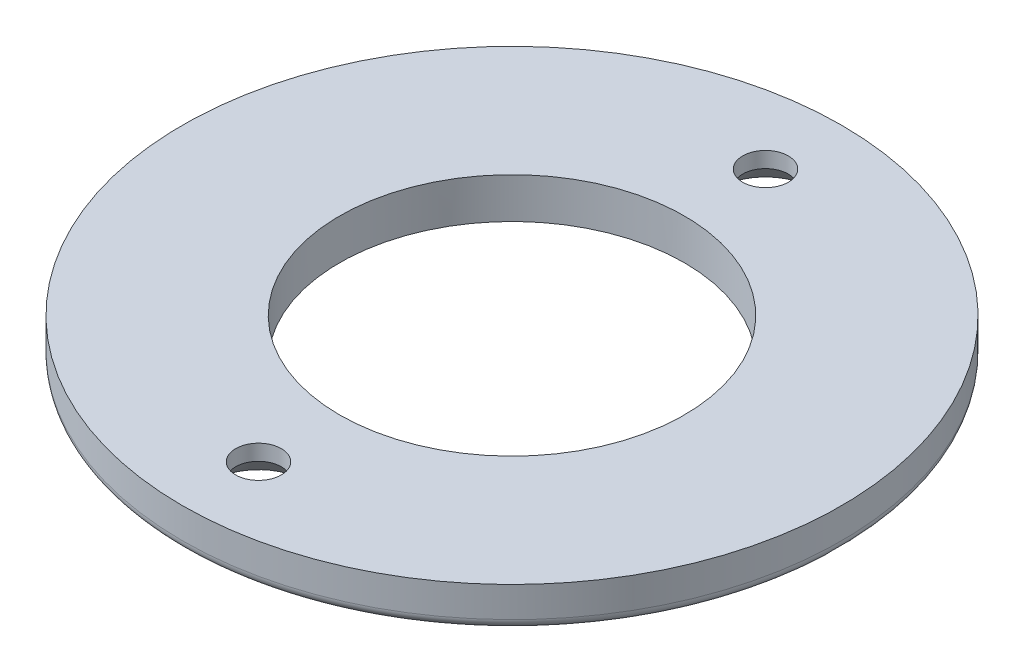
ISO-10303-21;
HEADER;
FILE_DESCRIPTION(('STEP AP214'),'2;1');
FILE_NAME('part.step','',(''),(''),'','','');
FILE_SCHEMA(('AUTOMOTIVE_DESIGN { 1 0 10303 214 1 1 1 1 }'));
ENDSEC;
DATA;
#1=APPLICATION_CONTEXT('core data for automotive mechanical design processes');
#2=APPLICATION_PROTOCOL_DEFINITION('international standard','automotive_design',2000,#1);
#3=PRODUCT_CONTEXT('',#1,'mechanical');
#4=PRODUCT('Part','Part','',(#3));
#5=PRODUCT_RELATED_PRODUCT_CATEGORY('part','',(#4));
#6=PRODUCT_DEFINITION_FORMATION('','',#4);
#7=PRODUCT_DEFINITION_CONTEXT('part definition',#1,'design');
#8=PRODUCT_DEFINITION('design','',#6,#7);
#9=PRODUCT_DEFINITION_SHAPE('','',#8);
#10=(LENGTH_UNIT() NAMED_UNIT(*) SI_UNIT(.MILLI.,.METRE.));
#11=(NAMED_UNIT(*) PLANE_ANGLE_UNIT() SI_UNIT($,.RADIAN.));
#12=(NAMED_UNIT(*) SI_UNIT($,.STERADIAN.) SOLID_ANGLE_UNIT());
#13=UNCERTAINTY_MEASURE_WITH_UNIT(LENGTH_MEASURE(1.E-05),#10,'distance_accuracy_value','');
#14=(GEOMETRIC_REPRESENTATION_CONTEXT(3) GLOBAL_UNCERTAINTY_ASSIGNED_CONTEXT((#13)) GLOBAL_UNIT_ASSIGNED_CONTEXT((#10,
#11,#12)) REPRESENTATION_CONTEXT('',''));
#15=CARTESIAN_POINT('',(0.,0.,0.));
#16=DIRECTION('',(0.,0.,1.));
#17=DIRECTION('',(1.,0.,0.));
#18=AXIS2_PLACEMENT_3D('',#15,#16,#17);
#19=CARTESIAN_POINT('',(0.,0.,0.));
#20=DIRECTION('',(0.,-1.,0.));
#21=DIRECTION('',(0.,0.,-1.));
#22=AXIS2_PLACEMENT_3D('',#19,#20,#21);
#23=PLANE('',#22);
#24=CARTESIAN_POINT('',(0.,0.,0.));
#25=DIRECTION('',(0.,-1.,0.));
#26=DIRECTION('',(0.,0.,-1.));
#27=AXIS2_PLACEMENT_3D('',#24,#25,#26);
#28=CIRCLE('',#27,17.);
#29=CARTESIAN_POINT('',(0.,0.,-17.));
#30=VERTEX_POINT('',#29);
#31=EDGE_CURVE('E83',#30,#30,#28,.T.);
#32=ORIENTED_EDGE('',*,*,#31,.F.);
#33=EDGE_LOOP('',(#32));
#34=FACE_BOUND('',#33,.T.);
#35=CARTESIAN_POINT('',(0.,0.,0.));
#36=DIRECTION('',(0.,-1.,0.));
#37=DIRECTION('',(0.,0.,-1.));
#38=AXIS2_PLACEMENT_3D('',#35,#36,#37);
#39=CIRCLE('',#38,31.5);
#40=CARTESIAN_POINT('',(0.,0.,-31.5));
#41=VERTEX_POINT('',#40);
#42=EDGE_CURVE('E10',#41,#41,#39,.T.);
#43=ORIENTED_EDGE('',*,*,#42,.T.);
#44=EDGE_LOOP('',(#43));
#45=FACE_BOUND('',#44,.T.);
#46=CARTESIAN_POINT('',(0.,0.,-25.));
#47=DIRECTION('',(0.,-1.,0.));
#48=DIRECTION('',(0.,0.,-1.));
#49=AXIS2_PLACEMENT_3D('',#46,#47,#48);
#50=CIRCLE('',#49,4.7);
#51=CARTESIAN_POINT('',(0.,0.,-29.7));
#52=VERTEX_POINT('',#51);
#53=EDGE_CURVE('E79',#52,#52,#50,.T.);
#54=ORIENTED_EDGE('',*,*,#53,.F.);
#55=EDGE_LOOP('',(#54));
#56=FACE_BOUND('',#55,.T.);
#57=CARTESIAN_POINT('',(0.,0.,25.));
#58=DIRECTION('',(0.,-1.,0.));
#59=DIRECTION('',(0.,0.,-1.));
#60=AXIS2_PLACEMENT_3D('',#57,#58,#59);
#61=CIRCLE('',#60,4.7);
#62=CARTESIAN_POINT('',(0.,0.,20.3));
#63=VERTEX_POINT('',#62);
#64=EDGE_CURVE('E67',#63,#63,#61,.T.);
#65=ORIENTED_EDGE('',*,*,#64,.F.);
#66=EDGE_LOOP('',(#65));
#67=FACE_BOUND('',#66,.T.);
#68=ADVANCED_FACE('F35',(#34,#45,#56,#67),#23,.T.);
#69=CARTESIAN_POINT('',(0.,0.,0.));
#70=DIRECTION('',(0.,1.,0.));
#71=DIRECTION('',(0.,0.,1.));
#72=AXIS2_PLACEMENT_3D('',#69,#70,#71);
#73=CYLINDRICAL_SURFACE('',#72,32.5);
#74=CARTESIAN_POINT('',(0.,0.999999999999998,0.));
#75=DIRECTION('',(0.,-1.,0.));
#76=DIRECTION('',(0.,0.,-1.));
#77=AXIS2_PLACEMENT_3D('',#74,#75,#76);
#78=CIRCLE('',#77,32.5);
#79=CARTESIAN_POINT('',(0.,0.999999999999998,-32.5));
#80=VERTEX_POINT('',#79);
#81=EDGE_CURVE('E43',#80,#80,#78,.F.);
#82=ORIENTED_EDGE('',*,*,#81,.T.);
#83=EDGE_LOOP('',(#82));
#84=FACE_BOUND('',#83,.T.);
#85=CARTESIAN_POINT('',(0.,4.,0.));
#86=DIRECTION('',(0.,1.,0.));
#87=DIRECTION('',(0.,0.,1.));
#88=AXIS2_PLACEMENT_3D('',#85,#86,#87);
#89=CIRCLE('',#88,32.5);
#90=CARTESIAN_POINT('',(0.,4.,32.5));
#91=VERTEX_POINT('',#90);
#92=EDGE_CURVE('E48',#91,#91,#89,.T.);
#93=ORIENTED_EDGE('',*,*,#92,.F.);
#94=EDGE_LOOP('',(#93));
#95=FACE_BOUND('',#94,.T.);
#96=ADVANCED_FACE('F91',(#84,#95),#73,.T.);
#97=CARTESIAN_POINT('',(-32.5,4.,0.));
#98=DIRECTION('',(0.,1.,0.));
#99=DIRECTION('',(0.,0.,1.));
#100=AXIS2_PLACEMENT_3D('',#97,#98,#99);
#101=PLANE('',#100);
#102=CARTESIAN_POINT('',(0.,4.,-25.));
#103=DIRECTION('',(0.,1.,0.));
#104=DIRECTION('',(0.,0.,1.));
#105=AXIS2_PLACEMENT_3D('',#102,#103,#104);
#106=CIRCLE('',#105,2.24999999999999);
#107=CARTESIAN_POINT('',(0.,4.,-22.75));
#108=VERTEX_POINT('',#107);
#109=EDGE_CURVE('E71',#108,#108,#106,.T.);
#110=ORIENTED_EDGE('',*,*,#109,.F.);
#111=EDGE_LOOP('',(#110));
#112=FACE_BOUND('',#111,.T.);
#113=CARTESIAN_POINT('',(0.,4.,25.));
#114=DIRECTION('',(0.,1.,0.));
#115=DIRECTION('',(0.,0.,1.));
#116=AXIS2_PLACEMENT_3D('',#113,#114,#115);
#117=CIRCLE('',#116,2.24999999999999);
#118=CARTESIAN_POINT('',(0.,4.,27.25));
#119=VERTEX_POINT('',#118);
#120=EDGE_CURVE('E59',#119,#119,#117,.T.);
#121=ORIENTED_EDGE('',*,*,#120,.F.);
#122=EDGE_LOOP('',(#121));
#123=FACE_BOUND('',#122,.T.);
#124=ORIENTED_EDGE('',*,*,#92,.T.);
#125=EDGE_LOOP('',(#124));
#126=FACE_BOUND('',#125,.T.);
#127=CARTESIAN_POINT('',(0.,4.,0.));
#128=DIRECTION('',(0.,1.,0.));
#129=DIRECTION('',(0.,0.,1.));
#130=AXIS2_PLACEMENT_3D('',#127,#128,#129);
#131=CIRCLE('',#130,17.);
#132=CARTESIAN_POINT('',(0.,4.,17.));
#133=VERTEX_POINT('',#132);
#134=EDGE_CURVE('E53',#133,#133,#131,.T.);
#135=ORIENTED_EDGE('',*,*,#134,.F.);
#136=EDGE_LOOP('',(#135));
#137=FACE_BOUND('',#136,.T.);
#138=ADVANCED_FACE('F117',(#112,#123,#126,#137),#101,.T.);
#139=CARTESIAN_POINT('',(0.,0.,0.));
#140=DIRECTION('',(0.,1.,0.));
#141=DIRECTION('',(0.,0.,1.));
#142=AXIS2_PLACEMENT_3D('',#139,#140,#141);
#143=CYLINDRICAL_SURFACE('',#142,17.);
#144=ORIENTED_EDGE('',*,*,#134,.T.);
#145=EDGE_LOOP('',(#144));
#146=FACE_BOUND('',#145,.T.);
#147=ORIENTED_EDGE('',*,*,#31,.T.);
#148=EDGE_LOOP('',(#147));
#149=FACE_BOUND('',#148,.T.);
#150=ADVANCED_FACE('F88',(#146,#149),#143,.F.);
#151=CARTESIAN_POINT('',(0.,0.,25.));
#152=DIRECTION('',(0.,-1.,0.));
#153=DIRECTION('',(0.,0.,-1.));
#154=AXIS2_PLACEMENT_3D('',#151,#152,#153);
#155=CYLINDRICAL_SURFACE('',#154,2.24999999999999);
#156=CARTESIAN_POINT('',(0.,2.45000000000001,25.));
#157=DIRECTION('',(0.,-1.,0.));
#158=DIRECTION('',(0.,0.,-1.));
#159=AXIS2_PLACEMENT_3D('',#156,#157,#158);
#160=CIRCLE('',#159,2.24999999999999);
#161=CARTESIAN_POINT('',(0.,2.45000000000001,22.75));
#162=VERTEX_POINT('',#161);
#163=EDGE_CURVE('E63',#162,#162,#160,.T.);
#164=ORIENTED_EDGE('',*,*,#163,.T.);
#165=EDGE_LOOP('',(#164));
#166=FACE_BOUND('',#165,.T.);
#167=ORIENTED_EDGE('',*,*,#120,.T.);
#168=EDGE_LOOP('',(#167));
#169=FACE_BOUND('',#168,.T.);
#170=ADVANCED_FACE('F100',(#166,#169),#155,.F.);
#171=CARTESIAN_POINT('',(0.,0.,25.));
#172=DIRECTION('',(0.,-1.,0.));
#173=DIRECTION('',(0.,0.,-1.));
#174=AXIS2_PLACEMENT_3D('',#171,#172,#173);
#175=CONICAL_SURFACE('',#174,4.7,0.785398163397449);
#176=ORIENTED_EDGE('',*,*,#163,.F.);
#177=EDGE_LOOP('',(#176));
#178=FACE_BOUND('',#177,.T.);
#179=ORIENTED_EDGE('',*,*,#64,.T.);
#180=EDGE_LOOP('',(#179));
#181=FACE_BOUND('',#180,.T.);
#182=ADVANCED_FACE('F97',(#178,#181),#175,.F.);
#183=CARTESIAN_POINT('',(0.,0.,-25.));
#184=DIRECTION('',(0.,-1.,0.));
#185=DIRECTION('',(0.,0.,-1.));
#186=AXIS2_PLACEMENT_3D('',#183,#184,#185);
#187=CYLINDRICAL_SURFACE('',#186,2.24999999999999);
#188=CARTESIAN_POINT('',(0.,2.45000000000001,-25.));
#189=DIRECTION('',(0.,-1.,0.));
#190=DIRECTION('',(0.,0.,-1.));
#191=AXIS2_PLACEMENT_3D('',#188,#189,#190);
#192=CIRCLE('',#191,2.24999999999999);
#193=CARTESIAN_POINT('',(0.,2.45000000000001,-27.25));
#194=VERTEX_POINT('',#193);
#195=EDGE_CURVE('E75',#194,#194,#192,.T.);
#196=ORIENTED_EDGE('',*,*,#195,.T.);
#197=EDGE_LOOP('',(#196));
#198=FACE_BOUND('',#197,.T.);
#199=ORIENTED_EDGE('',*,*,#109,.T.);
#200=EDGE_LOOP('',(#199));
#201=FACE_BOUND('',#200,.T.);
#202=ADVANCED_FACE('F99',(#198,#201),#187,.F.);
#203=CARTESIAN_POINT('',(0.,0.,-25.));
#204=DIRECTION('',(0.,-1.,0.));
#205=DIRECTION('',(0.,0.,-1.));
#206=AXIS2_PLACEMENT_3D('',#203,#204,#205);
#207=CONICAL_SURFACE('',#206,4.7,0.785398163397449);
#208=ORIENTED_EDGE('',*,*,#195,.F.);
#209=EDGE_LOOP('',(#208));
#210=FACE_BOUND('',#209,.T.);
#211=ORIENTED_EDGE('',*,*,#53,.T.);
#212=EDGE_LOOP('',(#211));
#213=FACE_BOUND('',#212,.T.);
#214=ADVANCED_FACE('F107',(#210,#213),#207,.F.);
#215=CARTESIAN_POINT('',(0.,0.999999999999998,0.));
#216=DIRECTION('',(0.,-1.,0.));
#217=DIRECTION('',(0.,0.,-1.));
#218=AXIS2_PLACEMENT_3D('',#215,#216,#217);
#219=TOROIDAL_SURFACE('',#218,31.5,1.);
#220=ORIENTED_EDGE('',*,*,#42,.F.);
#221=EDGE_LOOP('',(#220));
#222=FACE_BOUND('',#221,.T.);
#223=ORIENTED_EDGE('',*,*,#81,.F.);
#224=EDGE_LOOP('',(#223));
#225=FACE_BOUND('',#224,.T.);
#226=ADVANCED_FACE('F37',(#222,#225),#219,.T.);
#227=CLOSED_SHELL('',(#68,#96,#138,#150,#170,#182,#202,#214,#226));
#228=MANIFOLD_SOLID_BREP('B2',#227);
#229=ADVANCED_BREP_SHAPE_REPRESENTATION('',(#18,#228),#14);
#230=SHAPE_DEFINITION_REPRESENTATION(#9,#229);
ENDSEC;
END-ISO-10303-21;
